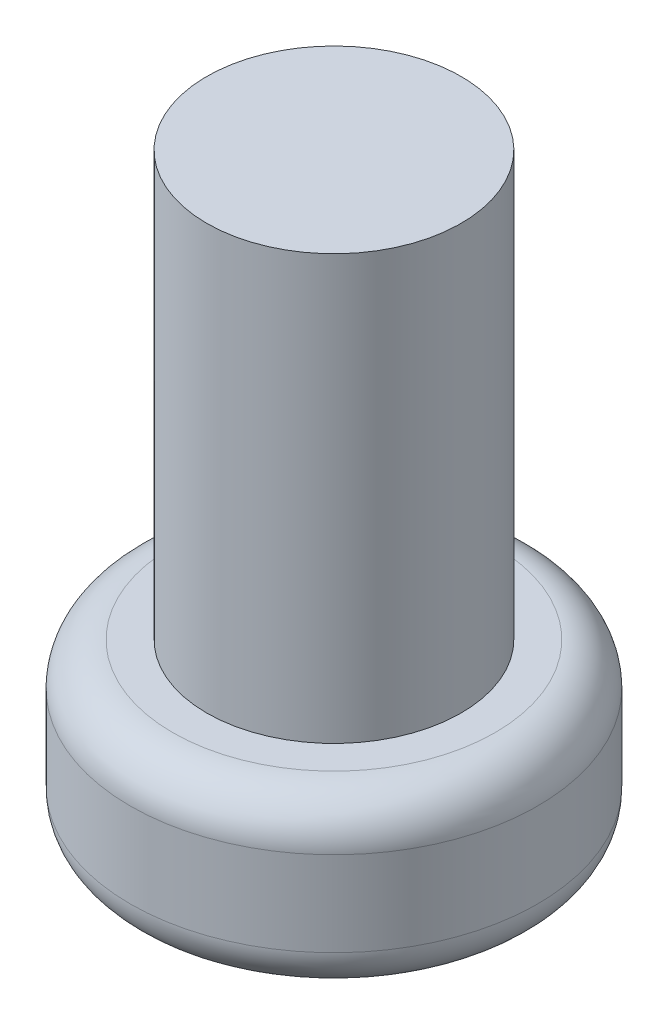
ISO-10303-21;
HEADER;
FILE_DESCRIPTION(('STEP AP214'),'2;1');
FILE_NAME('part.step','',(''),(''),'','','');
FILE_SCHEMA(('AUTOMOTIVE_DESIGN { 1 0 10303 214 1 1 1 1 }'));
ENDSEC;
DATA;
#1=APPLICATION_CONTEXT('core data for automotive mechanical design processes');
#2=APPLICATION_PROTOCOL_DEFINITION('international standard','automotive_design',2000,#1);
#3=PRODUCT_CONTEXT('',#1,'mechanical');
#4=PRODUCT('Part','Part','',(#3));
#5=PRODUCT_RELATED_PRODUCT_CATEGORY('part','',(#4));
#6=PRODUCT_DEFINITION_FORMATION('','',#4);
#7=PRODUCT_DEFINITION_CONTEXT('part definition',#1,'design');
#8=PRODUCT_DEFINITION('design','',#6,#7);
#9=PRODUCT_DEFINITION_SHAPE('','',#8);
#10=(LENGTH_UNIT() NAMED_UNIT(*) SI_UNIT(.MILLI.,.METRE.));
#11=(NAMED_UNIT(*) PLANE_ANGLE_UNIT() SI_UNIT($,.RADIAN.));
#12=(NAMED_UNIT(*) SI_UNIT($,.STERADIAN.) SOLID_ANGLE_UNIT());
#13=UNCERTAINTY_MEASURE_WITH_UNIT(LENGTH_MEASURE(1.E-05),#10,'distance_accuracy_value','');
#14=(GEOMETRIC_REPRESENTATION_CONTEXT(3) GLOBAL_UNCERTAINTY_ASSIGNED_CONTEXT((#13)) GLOBAL_UNIT_ASSIGNED_CONTEXT((#10,
#11,#12)) REPRESENTATION_CONTEXT('',''));
#15=CARTESIAN_POINT('',(0.,0.,0.));
#16=DIRECTION('',(0.,0.,1.));
#17=DIRECTION('',(1.,0.,0.));
#18=AXIS2_PLACEMENT_3D('',#15,#16,#17);
#19=CARTESIAN_POINT('',(0.,2.,0.));
#20=DIRECTION('',(0.,-1.,0.));
#21=DIRECTION('',(0.,0.,-1.));
#22=AXIS2_PLACEMENT_3D('',#19,#20,#21);
#23=CYLINDRICAL_SURFACE('',#22,2.4);
#24=CARTESIAN_POINT('',(0.,0.5,0.));
#25=DIRECTION('',(0.,1.,0.));
#26=DIRECTION('',(0.,0.,1.));
#27=AXIS2_PLACEMENT_3D('',#24,#25,#26);
#28=CIRCLE('',#27,2.4);
#29=CARTESIAN_POINT('',(0.,0.5,2.4));
#30=VERTEX_POINT('',#29);
#31=EDGE_CURVE('E216',#30,#30,#28,.T.);
#32=ORIENTED_EDGE('',*,*,#31,.T.);
#33=EDGE_LOOP('',(#32));
#34=FACE_BOUND('',#33,.T.);
#35=CARTESIAN_POINT('',(0.,1.5,0.));
#36=DIRECTION('',(0.,1.,0.));
#37=DIRECTION('',(0.,0.,1.));
#38=AXIS2_PLACEMENT_3D('',#35,#36,#37);
#39=CIRCLE('',#38,2.4);
#40=CARTESIAN_POINT('',(0.,1.5,2.4));
#41=VERTEX_POINT('',#40);
#42=EDGE_CURVE('E213',#41,#41,#39,.F.);
#43=ORIENTED_EDGE('',*,*,#42,.T.);
#44=EDGE_LOOP('',(#43));
#45=FACE_BOUND('',#44,.T.);
#46=ADVANCED_FACE('F34',(#34,#45),#23,.T.);
#47=CARTESIAN_POINT('',(0.,2.,0.));
#48=DIRECTION('',(0.,1.,0.));
#49=DIRECTION('',(0.,0.,1.));
#50=AXIS2_PLACEMENT_3D('',#47,#48,#49);
#51=PLANE('',#50);
#52=CARTESIAN_POINT('',(0.,2.,0.));
#53=DIRECTION('',(0.,1.,0.));
#54=DIRECTION('',(0.,0.,1.));
#55=AXIS2_PLACEMENT_3D('',#52,#53,#54);
#56=CIRCLE('',#55,1.9);
#57=CARTESIAN_POINT('',(0.,2.,1.9));
#58=VERTEX_POINT('',#57);
#59=EDGE_CURVE('E11',#58,#58,#56,.T.);
#60=ORIENTED_EDGE('',*,*,#59,.T.);
#61=EDGE_LOOP('',(#60));
#62=FACE_BOUND('',#61,.T.);
#63=CARTESIAN_POINT('',(0.,2.,0.));
#64=DIRECTION('',(0.,1.,0.));
#65=DIRECTION('',(0.,0.,1.));
#66=AXIS2_PLACEMENT_3D('',#63,#64,#65);
#67=CIRCLE('',#66,1.5);
#68=CARTESIAN_POINT('',(0.,2.,1.5));
#69=VERTEX_POINT('',#68);
#70=EDGE_CURVE('E210',#69,#69,#67,.T.);
#71=ORIENTED_EDGE('',*,*,#70,.F.);
#72=EDGE_LOOP('',(#71));
#73=FACE_BOUND('',#72,.T.);
#74=ADVANCED_FACE('F231',(#62,#73),#51,.T.);
#75=CARTESIAN_POINT('',(0.,0.,0.));
#76=DIRECTION('',(0.,1.,0.));
#77=DIRECTION('',(0.,0.,1.));
#78=AXIS2_PLACEMENT_3D('',#75,#76,#77);
#79=PLANE('',#78);
#80=DIRECTION('',(-1.,0.,0.));
#81=VECTOR('',#80,1.);
#82=CARTESIAN_POINT('',(-0.5,0.,1.5));
#83=LINE('',#82,#81);
#84=CARTESIAN_POINT('',(0.5,0.,1.5));
#85=VERTEX_POINT('',#84);
#86=CARTESIAN_POINT('',(-0.5,0.,1.5));
#87=VERTEX_POINT('',#86);
#88=EDGE_CURVE('E159',#85,#87,#83,.T.);
#89=ORIENTED_EDGE('',*,*,#88,.F.);
#90=DIRECTION('',(0.,0.,1.));
#91=VECTOR('',#90,1.);
#92=CARTESIAN_POINT('',(0.5,0.,0.5));
#93=LINE('',#92,#91);
#94=CARTESIAN_POINT('',(0.5,0.,0.5));
#95=VERTEX_POINT('',#94);
#96=EDGE_CURVE('E49',#95,#85,#93,.T.);
#97=ORIENTED_EDGE('',*,*,#96,.F.);
#98=DIRECTION('',(-1.,0.,0.));
#99=VECTOR('',#98,1.);
#100=CARTESIAN_POINT('',(0.5,0.,0.5));
#101=LINE('',#100,#99);
#102=CARTESIAN_POINT('',(1.5,0.,0.5));
#103=VERTEX_POINT('',#102);
#104=EDGE_CURVE('E186',#103,#95,#101,.T.);
#105=ORIENTED_EDGE('',*,*,#104,.F.);
#106=DIRECTION('',(0.,0.,1.));
#107=VECTOR('',#106,1.);
#108=CARTESIAN_POINT('',(1.5,0.,0.5));
#109=LINE('',#108,#107);
#110=CARTESIAN_POINT('',(1.5,0.,-0.5));
#111=VERTEX_POINT('',#110);
#112=EDGE_CURVE('E184',#111,#103,#109,.T.);
#113=ORIENTED_EDGE('',*,*,#112,.F.);
#114=DIRECTION('',(1.,0.,0.));
#115=VECTOR('',#114,1.);
#116=CARTESIAN_POINT('',(0.5,0.,-0.5));
#117=LINE('',#116,#115);
#118=CARTESIAN_POINT('',(0.5,0.,-0.5));
#119=VERTEX_POINT('',#118);
#120=EDGE_CURVE('E133',#119,#111,#117,.T.);
#121=ORIENTED_EDGE('',*,*,#120,.F.);
#122=DIRECTION('',(0.,0.,1.));
#123=VECTOR('',#122,1.);
#124=CARTESIAN_POINT('',(0.5,0.,-1.5));
#125=LINE('',#124,#123);
#126=CARTESIAN_POINT('',(0.5,0.,-1.5));
#127=VERTEX_POINT('',#126);
#128=EDGE_CURVE('E180',#127,#119,#125,.T.);
#129=ORIENTED_EDGE('',*,*,#128,.F.);
#130=DIRECTION('',(1.,0.,0.));
#131=VECTOR('',#130,1.);
#132=CARTESIAN_POINT('',(-0.5,0.,-1.5));
#133=LINE('',#132,#131);
#134=CARTESIAN_POINT('',(-0.5,0.,-1.5));
#135=VERTEX_POINT('',#134);
#136=EDGE_CURVE('E177',#135,#127,#133,.T.);
#137=ORIENTED_EDGE('',*,*,#136,.F.);
#138=DIRECTION('',(0.,0.,-1.));
#139=VECTOR('',#138,1.);
#140=CARTESIAN_POINT('',(-0.5,0.,-1.5));
#141=LINE('',#140,#139);
#142=CARTESIAN_POINT('',(-0.5,0.,-0.5));
#143=VERTEX_POINT('',#142);
#144=EDGE_CURVE('E174',#143,#135,#141,.T.);
#145=ORIENTED_EDGE('',*,*,#144,.F.);
#146=DIRECTION('',(1.,0.,0.));
#147=VECTOR('',#146,1.);
#148=CARTESIAN_POINT('',(-1.5,0.,-0.5));
#149=LINE('',#148,#147);
#150=CARTESIAN_POINT('',(-1.5,0.,-0.5));
#151=VERTEX_POINT('',#150);
#152=EDGE_CURVE('E171',#151,#143,#149,.T.);
#153=ORIENTED_EDGE('',*,*,#152,.F.);
#154=DIRECTION('',(0.,0.,-1.));
#155=VECTOR('',#154,1.);
#156=CARTESIAN_POINT('',(-1.5,0.,0.5));
#157=LINE('',#156,#155);
#158=CARTESIAN_POINT('',(-1.5,0.,0.5));
#159=VERTEX_POINT('',#158);
#160=EDGE_CURVE('E168',#159,#151,#157,.T.);
#161=ORIENTED_EDGE('',*,*,#160,.F.);
#162=DIRECTION('',(-1.,0.,0.));
#163=VECTOR('',#162,1.);
#164=CARTESIAN_POINT('',(-1.5,0.,0.5));
#165=LINE('',#164,#163);
#166=CARTESIAN_POINT('',(-0.5,0.,0.5));
#167=VERTEX_POINT('',#166);
#168=EDGE_CURVE('E165',#167,#159,#165,.T.);
#169=ORIENTED_EDGE('',*,*,#168,.F.);
#170=DIRECTION('',(0.,0.,-1.));
#171=VECTOR('',#170,1.);
#172=CARTESIAN_POINT('',(-0.5,0.,0.5));
#173=LINE('',#172,#171);
#174=EDGE_CURVE('E162',#87,#167,#173,.T.);
#175=ORIENTED_EDGE('',*,*,#174,.F.);
#176=EDGE_LOOP('',(#89,#97,#105,#113,#121,#129,#137,#145,#153,#161,#169,#175));
#177=FACE_BOUND('',#176,.T.);
#178=CARTESIAN_POINT('',(0.,0.,0.));
#179=DIRECTION('',(0.,1.,0.));
#180=DIRECTION('',(0.,0.,1.));
#181=AXIS2_PLACEMENT_3D('',#178,#179,#180);
#182=CIRCLE('',#181,1.9);
#183=CARTESIAN_POINT('',(0.,0.,1.9));
#184=VERTEX_POINT('',#183);
#185=EDGE_CURVE('E42',#184,#184,#182,.F.);
#186=ORIENTED_EDGE('',*,*,#185,.T.);
#187=EDGE_LOOP('',(#186));
#188=FACE_BOUND('',#187,.T.);
#189=ADVANCED_FACE('F221',(#177,#188),#79,.F.);
#190=CARTESIAN_POINT('',(0.,7.,0.));
#191=DIRECTION('',(0.,-1.,0.));
#192=DIRECTION('',(0.,0.,-1.));
#193=AXIS2_PLACEMENT_3D('',#190,#191,#192);
#194=CYLINDRICAL_SURFACE('',#193,1.5);
#195=CARTESIAN_POINT('',(0.,7.,0.));
#196=DIRECTION('',(0.,1.,0.));
#197=DIRECTION('',(0.,0.,1.));
#198=AXIS2_PLACEMENT_3D('',#195,#196,#197);
#199=CIRCLE('',#198,1.5);
#200=CARTESIAN_POINT('',(0.,7.,1.5));
#201=VERTEX_POINT('',#200);
#202=EDGE_CURVE('E190',#201,#201,#199,.T.);
#203=ORIENTED_EDGE('',*,*,#202,.F.);
#204=EDGE_LOOP('',(#203));
#205=FACE_BOUND('',#204,.T.);
#206=ORIENTED_EDGE('',*,*,#70,.T.);
#207=EDGE_LOOP('',(#206));
#208=FACE_BOUND('',#207,.T.);
#209=ADVANCED_FACE('F245',(#205,#208),#194,.T.);
#210=CARTESIAN_POINT('',(0.,7.,0.));
#211=DIRECTION('',(0.,1.,0.));
#212=DIRECTION('',(0.,0.,1.));
#213=AXIS2_PLACEMENT_3D('',#210,#211,#212);
#214=PLANE('',#213);
#215=ORIENTED_EDGE('',*,*,#202,.T.);
#216=EDGE_LOOP('',(#215));
#217=FACE_BOUND('',#216,.T.);
#218=ADVANCED_FACE('F226',(#217),#214,.T.);
#219=CARTESIAN_POINT('',(0.,0.5,0.));
#220=DIRECTION('',(0.,1.,0.));
#221=DIRECTION('',(0.,0.,1.));
#222=AXIS2_PLACEMENT_3D('',#219,#220,#221);
#223=TOROIDAL_SURFACE('',#222,1.9,0.5);
#224=ORIENTED_EDGE('',*,*,#185,.F.);
#225=EDGE_LOOP('',(#224));
#226=FACE_BOUND('',#225,.T.);
#227=ORIENTED_EDGE('',*,*,#31,.F.);
#228=EDGE_LOOP('',(#227));
#229=FACE_BOUND('',#228,.T.);
#230=ADVANCED_FACE('F223',(#226,#229),#223,.T.);
#231=CARTESIAN_POINT('',(0.,1.5,0.));
#232=DIRECTION('',(0.,1.,0.));
#233=DIRECTION('',(0.,0.,1.));
#234=AXIS2_PLACEMENT_3D('',#231,#232,#233);
#235=TOROIDAL_SURFACE('',#234,1.9,0.5);
#236=ORIENTED_EDGE('',*,*,#42,.F.);
#237=EDGE_LOOP('',(#236));
#238=FACE_BOUND('',#237,.T.);
#239=ORIENTED_EDGE('',*,*,#59,.F.);
#240=EDGE_LOOP('',(#239));
#241=FACE_BOUND('',#240,.T.);
#242=ADVANCED_FACE('F36',(#238,#241),#235,.T.);
#243=CARTESIAN_POINT('',(0.5,0.5,0.5));
#244=DIRECTION('',(1.,0.,0.));
#245=DIRECTION('',(0.,0.,-1.));
#246=AXIS2_PLACEMENT_3D('',#243,#244,#245);
#247=PLANE('',#246);
#248=ORIENTED_EDGE('',*,*,#96,.T.);
#249=DIRECTION('',(0.,-1.,0.));
#250=VECTOR('',#249,1.);
#251=CARTESIAN_POINT('',(0.5,0.5,1.5));
#252=LINE('',#251,#250);
#253=CARTESIAN_POINT('',(0.5,0.5,1.5));
#254=VERTEX_POINT('',#253);
#255=EDGE_CURVE('E97',#254,#85,#252,.T.);
#256=ORIENTED_EDGE('',*,*,#255,.F.);
#257=DIRECTION('',(0.,0.,1.));
#258=VECTOR('',#257,1.);
#259=CARTESIAN_POINT('',(0.5,0.5,0.5));
#260=LINE('',#259,#258);
#261=CARTESIAN_POINT('',(0.5,0.5,0.5));
#262=VERTEX_POINT('',#261);
#263=EDGE_CURVE('E188',#262,#254,#260,.T.);
#264=ORIENTED_EDGE('',*,*,#263,.F.);
#265=DIRECTION('',(0.,-1.,0.));
#266=VECTOR('',#265,1.);
#267=CARTESIAN_POINT('',(0.5,0.5,0.5));
#268=LINE('',#267,#266);
#269=EDGE_CURVE('E57',#262,#95,#268,.T.);
#270=ORIENTED_EDGE('',*,*,#269,.T.);
#271=EDGE_LOOP('',(#248,#256,#264,#270));
#272=FACE_BOUND('',#271,.T.);
#273=ADVANCED_FACE('F237',(#272),#247,.F.);
#274=CARTESIAN_POINT('',(0.5,0.5,0.5));
#275=DIRECTION('',(0.,0.,1.));
#276=DIRECTION('',(1.,0.,0.));
#277=AXIS2_PLACEMENT_3D('',#274,#275,#276);
#278=PLANE('',#277);
#279=ORIENTED_EDGE('',*,*,#104,.T.);
#280=ORIENTED_EDGE('',*,*,#269,.F.);
#281=DIRECTION('',(-1.,0.,0.));
#282=VECTOR('',#281,1.);
#283=CARTESIAN_POINT('',(0.5,0.5,0.5));
#284=LINE('',#283,#282);
#285=CARTESIAN_POINT('',(1.5,0.5,0.5));
#286=VERTEX_POINT('',#285);
#287=EDGE_CURVE('E145',#286,#262,#284,.T.);
#288=ORIENTED_EDGE('',*,*,#287,.F.);
#289=DIRECTION('',(0.,-1.,0.));
#290=VECTOR('',#289,1.);
#291=CARTESIAN_POINT('',(1.5,0.5,0.5));
#292=LINE('',#291,#290);
#293=EDGE_CURVE('E137',#286,#103,#292,.T.);
#294=ORIENTED_EDGE('',*,*,#293,.T.);
#295=EDGE_LOOP('',(#279,#280,#288,#294));
#296=FACE_BOUND('',#295,.T.);
#297=ADVANCED_FACE('F261',(#296),#278,.F.);
#298=CARTESIAN_POINT('',(1.5,0.5,0.5));
#299=DIRECTION('',(1.,0.,0.));
#300=DIRECTION('',(0.,0.,-1.));
#301=AXIS2_PLACEMENT_3D('',#298,#299,#300);
#302=PLANE('',#301);
#303=ORIENTED_EDGE('',*,*,#112,.T.);
#304=ORIENTED_EDGE('',*,*,#293,.F.);
#305=DIRECTION('',(0.,0.,1.));
#306=VECTOR('',#305,1.);
#307=CARTESIAN_POINT('',(1.5,0.5,0.5));
#308=LINE('',#307,#306);
#309=CARTESIAN_POINT('',(1.5,0.5,-0.5));
#310=VERTEX_POINT('',#309);
#311=EDGE_CURVE('E141',#310,#286,#308,.T.);
#312=ORIENTED_EDGE('',*,*,#311,.F.);
#313=DIRECTION('',(0.,-1.,0.));
#314=VECTOR('',#313,1.);
#315=CARTESIAN_POINT('',(1.5,0.5,-0.5));
#316=LINE('',#315,#314);
#317=EDGE_CURVE('E126',#310,#111,#316,.T.);
#318=ORIENTED_EDGE('',*,*,#317,.T.);
#319=EDGE_LOOP('',(#303,#304,#312,#318));
#320=FACE_BOUND('',#319,.T.);
#321=ADVANCED_FACE('F142',(#320),#302,.F.);
#322=CARTESIAN_POINT('',(0.5,0.5,-0.5));
#323=DIRECTION('',(0.,0.,-1.));
#324=DIRECTION('',(-1.,0.,0.));
#325=AXIS2_PLACEMENT_3D('',#322,#323,#324);
#326=PLANE('',#325);
#327=ORIENTED_EDGE('',*,*,#120,.T.);
#328=ORIENTED_EDGE('',*,*,#317,.F.);
#329=DIRECTION('',(1.,0.,0.));
#330=VECTOR('',#329,1.);
#331=CARTESIAN_POINT('',(0.5,0.5,-0.5));
#332=LINE('',#331,#330);
#333=CARTESIAN_POINT('',(0.5,0.5,-0.5));
#334=VERTEX_POINT('',#333);
#335=EDGE_CURVE('E130',#334,#310,#332,.T.);
#336=ORIENTED_EDGE('',*,*,#335,.F.);
#337=DIRECTION('',(0.,-1.,0.));
#338=VECTOR('',#337,1.);
#339=CARTESIAN_POINT('',(0.5,0.5,-0.5));
#340=LINE('',#339,#338);
#341=EDGE_CURVE('E138',#334,#119,#340,.T.);
#342=ORIENTED_EDGE('',*,*,#341,.T.);
#343=EDGE_LOOP('',(#327,#328,#336,#342));
#344=FACE_BOUND('',#343,.T.);
#345=ADVANCED_FACE('F128',(#344),#326,.F.);
#346=CARTESIAN_POINT('',(0.5,0.5,-1.5));
#347=DIRECTION('',(1.,0.,0.));
#348=DIRECTION('',(0.,0.,-1.));
#349=AXIS2_PLACEMENT_3D('',#346,#347,#348);
#350=PLANE('',#349);
#351=ORIENTED_EDGE('',*,*,#128,.T.);
#352=ORIENTED_EDGE('',*,*,#341,.F.);
#353=DIRECTION('',(0.,0.,1.));
#354=VECTOR('',#353,1.);
#355=CARTESIAN_POINT('',(0.5,0.5,-1.5));
#356=LINE('',#355,#354);
#357=CARTESIAN_POINT('',(0.5,0.5,-1.5));
#358=VERTEX_POINT('',#357);
#359=EDGE_CURVE('E151',#358,#334,#356,.T.);
#360=ORIENTED_EDGE('',*,*,#359,.F.);
#361=DIRECTION('',(0.,-1.,0.));
#362=VECTOR('',#361,1.);
#363=CARTESIAN_POINT('',(0.5,0.5,-1.5));
#364=LINE('',#363,#362);
#365=EDGE_CURVE('E193',#358,#127,#364,.T.);
#366=ORIENTED_EDGE('',*,*,#365,.T.);
#367=EDGE_LOOP('',(#351,#352,#360,#366));
#368=FACE_BOUND('',#367,.T.);
#369=ADVANCED_FACE('F289',(#368),#350,.F.);
#370=CARTESIAN_POINT('',(-0.5,0.5,-1.5));
#371=DIRECTION('',(0.,0.,-1.));
#372=DIRECTION('',(-1.,0.,0.));
#373=AXIS2_PLACEMENT_3D('',#370,#371,#372);
#374=PLANE('',#373);
#375=ORIENTED_EDGE('',*,*,#136,.T.);
#376=ORIENTED_EDGE('',*,*,#365,.F.);
#377=DIRECTION('',(1.,0.,0.));
#378=VECTOR('',#377,1.);
#379=CARTESIAN_POINT('',(-0.5,0.5,-1.5));
#380=LINE('',#379,#378);
#381=CARTESIAN_POINT('',(-0.5,0.5,-1.5));
#382=VERTEX_POINT('',#381);
#383=EDGE_CURVE('E153',#382,#358,#380,.T.);
#384=ORIENTED_EDGE('',*,*,#383,.F.);
#385=DIRECTION('',(0.,-1.,0.));
#386=VECTOR('',#385,1.);
#387=CARTESIAN_POINT('',(-0.5,0.5,-1.5));
#388=LINE('',#387,#386);
#389=EDGE_CURVE('E195',#382,#135,#388,.T.);
#390=ORIENTED_EDGE('',*,*,#389,.T.);
#391=EDGE_LOOP('',(#375,#376,#384,#390));
#392=FACE_BOUND('',#391,.T.);
#393=ADVANCED_FACE('F285',(#392),#374,.F.);
#394=CARTESIAN_POINT('',(-0.5,0.5,-1.5));
#395=DIRECTION('',(-1.,0.,0.));
#396=DIRECTION('',(0.,0.,1.));
#397=AXIS2_PLACEMENT_3D('',#394,#395,#396);
#398=PLANE('',#397);
#399=ORIENTED_EDGE('',*,*,#144,.T.);
#400=ORIENTED_EDGE('',*,*,#389,.F.);
#401=DIRECTION('',(0.,0.,-1.));
#402=VECTOR('',#401,1.);
#403=CARTESIAN_POINT('',(-0.5,0.5,-1.5));
#404=LINE('',#403,#402);
#405=CARTESIAN_POINT('',(-0.5,0.5,-0.5));
#406=VERTEX_POINT('',#405);
#407=EDGE_CURVE('E441',#406,#382,#404,.T.);
#408=ORIENTED_EDGE('',*,*,#407,.F.);
#409=DIRECTION('',(0.,-1.,0.));
#410=VECTOR('',#409,1.);
#411=CARTESIAN_POINT('',(-0.5,0.5,-0.5));
#412=LINE('',#411,#410);
#413=EDGE_CURVE('E197',#406,#143,#412,.T.);
#414=ORIENTED_EDGE('',*,*,#413,.T.);
#415=EDGE_LOOP('',(#399,#400,#408,#414));
#416=FACE_BOUND('',#415,.T.);
#417=ADVANCED_FACE('F281',(#416),#398,.F.);
#418=CARTESIAN_POINT('',(-1.5,0.5,-0.5));
#419=DIRECTION('',(0.,0.,-1.));
#420=DIRECTION('',(-1.,0.,0.));
#421=AXIS2_PLACEMENT_3D('',#418,#419,#420);
#422=PLANE('',#421);
#423=ORIENTED_EDGE('',*,*,#152,.T.);
#424=ORIENTED_EDGE('',*,*,#413,.F.);
#425=DIRECTION('',(1.,0.,0.));
#426=VECTOR('',#425,1.);
#427=CARTESIAN_POINT('',(-1.5,0.5,-0.5));
#428=LINE('',#427,#426);
#429=CARTESIAN_POINT('',(-1.5,0.5,-0.5));
#430=VERTEX_POINT('',#429);
#431=EDGE_CURVE('E438',#430,#406,#428,.T.);
#432=ORIENTED_EDGE('',*,*,#431,.F.);
#433=DIRECTION('',(0.,-1.,0.));
#434=VECTOR('',#433,1.);
#435=CARTESIAN_POINT('',(-1.5,0.5,-0.5));
#436=LINE('',#435,#434);
#437=EDGE_CURVE('E199',#430,#151,#436,.T.);
#438=ORIENTED_EDGE('',*,*,#437,.T.);
#439=EDGE_LOOP('',(#423,#424,#432,#438));
#440=FACE_BOUND('',#439,.T.);
#441=ADVANCED_FACE('F277',(#440),#422,.F.);
#442=CARTESIAN_POINT('',(-1.5,0.5,0.5));
#443=DIRECTION('',(-1.,0.,0.));
#444=DIRECTION('',(0.,0.,1.));
#445=AXIS2_PLACEMENT_3D('',#442,#443,#444);
#446=PLANE('',#445);
#447=ORIENTED_EDGE('',*,*,#160,.T.);
#448=ORIENTED_EDGE('',*,*,#437,.F.);
#449=DIRECTION('',(0.,0.,-1.));
#450=VECTOR('',#449,1.);
#451=CARTESIAN_POINT('',(-1.5,0.5,0.5));
#452=LINE('',#451,#450);
#453=CARTESIAN_POINT('',(-1.5,0.5,0.5));
#454=VERTEX_POINT('',#453);
#455=EDGE_CURVE('E435',#454,#430,#452,.T.);
#456=ORIENTED_EDGE('',*,*,#455,.F.);
#457=DIRECTION('',(0.,-1.,0.));
#458=VECTOR('',#457,1.);
#459=CARTESIAN_POINT('',(-1.5,0.5,0.5));
#460=LINE('',#459,#458);
#461=EDGE_CURVE('E201',#454,#159,#460,.T.);
#462=ORIENTED_EDGE('',*,*,#461,.T.);
#463=EDGE_LOOP('',(#447,#448,#456,#462));
#464=FACE_BOUND('',#463,.T.);
#465=ADVANCED_FACE('F273',(#464),#446,.F.);
#466=CARTESIAN_POINT('',(-1.5,0.5,0.5));
#467=DIRECTION('',(0.,0.,1.));
#468=DIRECTION('',(1.,0.,0.));
#469=AXIS2_PLACEMENT_3D('',#466,#467,#468);
#470=PLANE('',#469);
#471=ORIENTED_EDGE('',*,*,#168,.T.);
#472=ORIENTED_EDGE('',*,*,#461,.F.);
#473=DIRECTION('',(-1.,0.,0.));
#474=VECTOR('',#473,1.);
#475=CARTESIAN_POINT('',(-1.5,0.5,0.5));
#476=LINE('',#475,#474);
#477=CARTESIAN_POINT('',(-0.5,0.5,0.5));
#478=VERTEX_POINT('',#477);
#479=EDGE_CURVE('E432',#478,#454,#476,.T.);
#480=ORIENTED_EDGE('',*,*,#479,.F.);
#481=DIRECTION('',(0.,-1.,0.));
#482=VECTOR('',#481,1.);
#483=CARTESIAN_POINT('',(-0.5,0.5,0.5));
#484=LINE('',#483,#482);
#485=EDGE_CURVE('E203',#478,#167,#484,.T.);
#486=ORIENTED_EDGE('',*,*,#485,.T.);
#487=EDGE_LOOP('',(#471,#472,#480,#486));
#488=FACE_BOUND('',#487,.T.);
#489=ADVANCED_FACE('F269',(#488),#470,.F.);
#490=CARTESIAN_POINT('',(-0.5,0.5,0.5));
#491=DIRECTION('',(-1.,0.,0.));
#492=DIRECTION('',(0.,0.,1.));
#493=AXIS2_PLACEMENT_3D('',#490,#491,#492);
#494=PLANE('',#493);
#495=ORIENTED_EDGE('',*,*,#174,.T.);
#496=ORIENTED_EDGE('',*,*,#485,.F.);
#497=DIRECTION('',(0.,0.,-1.));
#498=VECTOR('',#497,1.);
#499=CARTESIAN_POINT('',(-0.5,0.5,0.5));
#500=LINE('',#499,#498);
#501=CARTESIAN_POINT('',(-0.5,0.5,1.5));
#502=VERTEX_POINT('',#501);
#503=EDGE_CURVE('E427',#502,#478,#500,.T.);
#504=ORIENTED_EDGE('',*,*,#503,.F.);
#505=DIRECTION('',(0.,-1.,0.));
#506=VECTOR('',#505,1.);
#507=CARTESIAN_POINT('',(-0.5,0.5,1.5));
#508=LINE('',#507,#506);
#509=EDGE_CURVE('E205',#502,#87,#508,.T.);
#510=ORIENTED_EDGE('',*,*,#509,.T.);
#511=EDGE_LOOP('',(#495,#496,#504,#510));
#512=FACE_BOUND('',#511,.T.);
#513=ADVANCED_FACE('F265',(#512),#494,.F.);
#514=CARTESIAN_POINT('',(-0.5,0.5,1.5));
#515=DIRECTION('',(0.,0.,1.));
#516=DIRECTION('',(1.,0.,0.));
#517=AXIS2_PLACEMENT_3D('',#514,#515,#516);
#518=PLANE('',#517);
#519=ORIENTED_EDGE('',*,*,#88,.T.);
#520=ORIENTED_EDGE('',*,*,#509,.F.);
#521=DIRECTION('',(-1.,0.,0.));
#522=VECTOR('',#521,1.);
#523=CARTESIAN_POINT('',(-0.5,0.5,1.5));
#524=LINE('',#523,#522);
#525=EDGE_CURVE('E425',#254,#502,#524,.T.);
#526=ORIENTED_EDGE('',*,*,#525,.F.);
#527=ORIENTED_EDGE('',*,*,#255,.T.);
#528=EDGE_LOOP('',(#519,#520,#526,#527));
#529=FACE_BOUND('',#528,.T.);
#530=ADVANCED_FACE('F262',(#529),#518,.F.);
#531=CARTESIAN_POINT('',(0.,0.5,0.));
#532=DIRECTION('',(0.,1.,0.));
#533=DIRECTION('',(0.,0.,1.));
#534=AXIS2_PLACEMENT_3D('',#531,#532,#533);
#535=PLANE('',#534);
#536=ORIENTED_EDGE('',*,*,#263,.T.);
#537=ORIENTED_EDGE('',*,*,#525,.T.);
#538=ORIENTED_EDGE('',*,*,#503,.T.);
#539=ORIENTED_EDGE('',*,*,#479,.T.);
#540=ORIENTED_EDGE('',*,*,#455,.T.);
#541=ORIENTED_EDGE('',*,*,#431,.T.);
#542=ORIENTED_EDGE('',*,*,#407,.T.);
#543=ORIENTED_EDGE('',*,*,#383,.T.);
#544=ORIENTED_EDGE('',*,*,#359,.T.);
#545=ORIENTED_EDGE('',*,*,#335,.T.);
#546=ORIENTED_EDGE('',*,*,#311,.T.);
#547=ORIENTED_EDGE('',*,*,#287,.T.);
#548=EDGE_LOOP('',(#536,#537,#538,#539,#540,#541,#542,#543,#544,#545,#546,#547));
#549=FACE_BOUND('',#548,.T.);
#550=ADVANCED_FACE('F148',(#549),#535,.F.);
#551=CLOSED_SHELL('',(#46,#74,#189,#209,#218,#230,#242,#273,#297,#321,#345,#369,#393,#417,#441,
#465,#489,#513,#530,#550));
#552=MANIFOLD_SOLID_BREP('B2',#551);
#553=ADVANCED_BREP_SHAPE_REPRESENTATION('',(#18,#552),#14);
#554=SHAPE_DEFINITION_REPRESENTATION(#9,#553);
ENDSEC;
END-ISO-10303-21;
